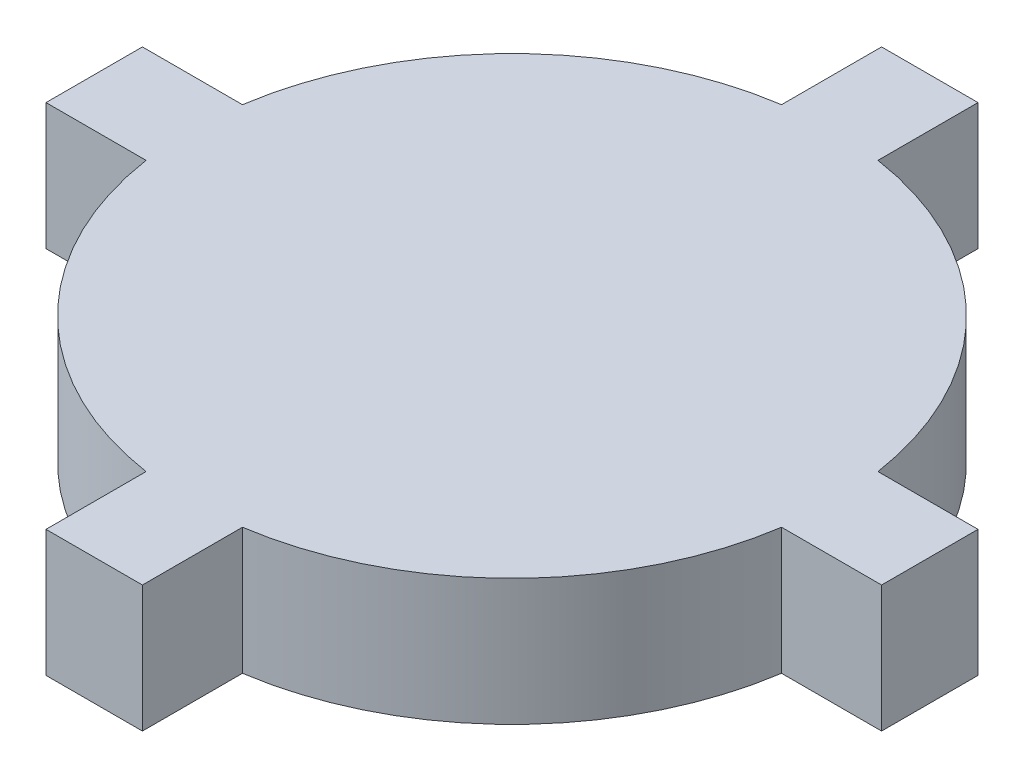
ISO-10303-21;
HEADER;
FILE_DESCRIPTION(('STEP AP214'),'2;1');
FILE_NAME('part.step','',(''),(''),'','','');
FILE_SCHEMA(('AUTOMOTIVE_DESIGN { 1 0 10303 214 1 1 1 1 }'));
ENDSEC;
DATA;
#1=APPLICATION_CONTEXT('core data for automotive mechanical design processes');
#2=APPLICATION_PROTOCOL_DEFINITION('international standard','automotive_design',2000,#1);
#3=PRODUCT_CONTEXT('',#1,'mechanical');
#4=PRODUCT('Part','Part','',(#3));
#5=PRODUCT_RELATED_PRODUCT_CATEGORY('part','',(#4));
#6=PRODUCT_DEFINITION_FORMATION('','',#4);
#7=PRODUCT_DEFINITION_CONTEXT('part definition',#1,'design');
#8=PRODUCT_DEFINITION('design','',#6,#7);
#9=PRODUCT_DEFINITION_SHAPE('','',#8);
#10=(LENGTH_UNIT() NAMED_UNIT(*) SI_UNIT(.MILLI.,.METRE.));
#11=(NAMED_UNIT(*) PLANE_ANGLE_UNIT() SI_UNIT($,.RADIAN.));
#12=(NAMED_UNIT(*) SI_UNIT($,.STERADIAN.) SOLID_ANGLE_UNIT());
#13=UNCERTAINTY_MEASURE_WITH_UNIT(LENGTH_MEASURE(1.E-05),#10,'distance_accuracy_value','');
#14=(GEOMETRIC_REPRESENTATION_CONTEXT(3) GLOBAL_UNCERTAINTY_ASSIGNED_CONTEXT((#13)) GLOBAL_UNIT_ASSIGNED_CONTEXT((#10,
#11,#12)) REPRESENTATION_CONTEXT('',''));
#15=CARTESIAN_POINT('',(0.,0.,0.));
#16=DIRECTION('',(0.,0.,1.));
#17=DIRECTION('',(1.,0.,0.));
#18=AXIS2_PLACEMENT_3D('',#15,#16,#17);
#19=CARTESIAN_POINT('',(16.51,5.,-1.905));
#20=DIRECTION('',(0.,0.,1.));
#21=DIRECTION('',(1.,0.,0.));
#22=AXIS2_PLACEMENT_3D('',#19,#20,#21);
#23=PLANE('',#22);
#24=DIRECTION('',(-1.,0.,0.));
#25=VECTOR('',#24,1.);
#26=CARTESIAN_POINT('',(16.51,0.,-1.905));
#27=LINE('',#26,#25);
#28=CARTESIAN_POINT('',(16.51,0.,-1.905));
#29=VERTEX_POINT('',#28);
#30=CARTESIAN_POINT('',(12.5563121576361,0.,-1.905));
#31=VERTEX_POINT('',#30);
#32=EDGE_CURVE('E183',#29,#31,#27,.T.);
#33=ORIENTED_EDGE('',*,*,#32,.T.);
#34=DIRECTION('',(0.,-1.,0.));
#35=VECTOR('',#34,1.);
#36=CARTESIAN_POINT('',(12.5563121576361,5.,-1.905));
#37=LINE('',#36,#35);
#38=CARTESIAN_POINT('',(12.5563121576361,5.,-1.905));
#39=VERTEX_POINT('',#38);
#40=EDGE_CURVE('E11',#39,#31,#37,.T.);
#41=ORIENTED_EDGE('',*,*,#40,.F.);
#42=DIRECTION('',(-1.,0.,0.));
#43=VECTOR('',#42,1.);
#44=CARTESIAN_POINT('',(16.51,5.,-1.905));
#45=LINE('',#44,#43);
#46=CARTESIAN_POINT('',(16.51,5.,-1.905));
#47=VERTEX_POINT('',#46);
#48=EDGE_CURVE('E213',#47,#39,#45,.T.);
#49=ORIENTED_EDGE('',*,*,#48,.F.);
#50=DIRECTION('',(0.,-1.,0.));
#51=VECTOR('',#50,1.);
#52=CARTESIAN_POINT('',(16.51,5.,-1.905));
#53=LINE('',#52,#51);
#54=EDGE_CURVE('E179',#47,#29,#53,.T.);
#55=ORIENTED_EDGE('',*,*,#54,.T.);
#56=EDGE_LOOP('',(#33,#41,#49,#55));
#57=FACE_BOUND('',#56,.T.);
#58=ADVANCED_FACE('F39',(#57),#23,.F.);
#59=CARTESIAN_POINT('',(0.,5.,0.));
#60=DIRECTION('',(0.,-1.,0.));
#61=DIRECTION('',(0.,0.,-1.));
#62=AXIS2_PLACEMENT_3D('',#59,#60,#61);
#63=CYLINDRICAL_SURFACE('',#62,12.7);
#64=CARTESIAN_POINT('',(0.,0.,0.));
#65=DIRECTION('',(0.,1.,0.));
#66=DIRECTION('',(0.,0.,1.));
#67=AXIS2_PLACEMENT_3D('',#64,#65,#66);
#68=CIRCLE('',#67,12.7);
#69=CARTESIAN_POINT('',(1.90500000000013,0.,-12.5563121576361));
#70=VERTEX_POINT('',#69);
#71=EDGE_CURVE('E186',#31,#70,#68,.T.);
#72=ORIENTED_EDGE('',*,*,#71,.T.);
#73=DIRECTION('',(0.,-1.,0.));
#74=VECTOR('',#73,1.);
#75=CARTESIAN_POINT('',(1.90500000000013,5.,-12.5563121576361));
#76=LINE('',#75,#74);
#77=CARTESIAN_POINT('',(1.90500000000013,5.,-12.5563121576361));
#78=VERTEX_POINT('',#77);
#79=EDGE_CURVE('E47',#78,#70,#76,.T.);
#80=ORIENTED_EDGE('',*,*,#79,.F.);
#81=CARTESIAN_POINT('',(0.,5.,0.));
#82=DIRECTION('',(0.,1.,0.));
#83=DIRECTION('',(0.,0.,1.));
#84=AXIS2_PLACEMENT_3D('',#81,#82,#83);
#85=CIRCLE('',#84,12.7);
#86=EDGE_CURVE('E122',#39,#78,#85,.T.);
#87=ORIENTED_EDGE('',*,*,#86,.F.);
#88=ORIENTED_EDGE('',*,*,#40,.T.);
#89=EDGE_LOOP('',(#72,#80,#87,#88));
#90=FACE_BOUND('',#89,.T.);
#91=ADVANCED_FACE('F311',(#90),#63,.T.);
#92=CARTESIAN_POINT('',(1.90500000000017,5.,-16.51));
#93=DIRECTION('',(-1.,0.,0.));
#94=DIRECTION('',(0.,0.,1.));
#95=AXIS2_PLACEMENT_3D('',#92,#93,#94);
#96=PLANE('',#95);
#97=DIRECTION('',(0.,0.,-1.));
#98=VECTOR('',#97,1.);
#99=CARTESIAN_POINT('',(1.90500000000017,0.,-16.51));
#100=LINE('',#99,#98);
#101=CARTESIAN_POINT('',(1.90500000000017,0.,-16.51));
#102=VERTEX_POINT('',#101);
#103=EDGE_CURVE('E188',#70,#102,#100,.T.);
#104=ORIENTED_EDGE('',*,*,#103,.T.);
#105=DIRECTION('',(0.,-1.,0.));
#106=VECTOR('',#105,1.);
#107=CARTESIAN_POINT('',(1.90500000000017,5.,-16.51));
#108=LINE('',#107,#106);
#109=CARTESIAN_POINT('',(1.90500000000017,5.,-16.51));
#110=VERTEX_POINT('',#109);
#111=EDGE_CURVE('E244',#110,#102,#108,.T.);
#112=ORIENTED_EDGE('',*,*,#111,.F.);
#113=DIRECTION('',(0.,0.,-1.));
#114=VECTOR('',#113,1.);
#115=CARTESIAN_POINT('',(1.90500000000017,5.,-16.51));
#116=LINE('',#115,#114);
#117=EDGE_CURVE('E252',#78,#110,#116,.T.);
#118=ORIENTED_EDGE('',*,*,#117,.F.);
#119=ORIENTED_EDGE('',*,*,#79,.T.);
#120=EDGE_LOOP('',(#104,#112,#118,#119));
#121=FACE_BOUND('',#120,.T.);
#122=ADVANCED_FACE('F250',(#121),#96,.F.);
#123=CARTESIAN_POINT('',(1.90500000000017,5.,-16.51));
#124=DIRECTION('',(0.,0.,1.));
#125=DIRECTION('',(1.,0.,0.));
#126=AXIS2_PLACEMENT_3D('',#123,#124,#125);
#127=PLANE('',#126);
#128=DIRECTION('',(-1.,0.,0.));
#129=VECTOR('',#128,1.);
#130=CARTESIAN_POINT('',(1.90500000000017,0.,-16.51));
#131=LINE('',#130,#129);
#132=CARTESIAN_POINT('',(-1.90499999999983,0.,-16.51));
#133=VERTEX_POINT('',#132);
#134=EDGE_CURVE('E190',#102,#133,#131,.T.);
#135=ORIENTED_EDGE('',*,*,#134,.T.);
#136=DIRECTION('',(0.,-1.,0.));
#137=VECTOR('',#136,1.);
#138=CARTESIAN_POINT('',(-1.90499999999983,5.,-16.51));
#139=LINE('',#138,#137);
#140=CARTESIAN_POINT('',(-1.90499999999983,5.,-16.51));
#141=VERTEX_POINT('',#140);
#142=EDGE_CURVE('E241',#141,#133,#139,.T.);
#143=ORIENTED_EDGE('',*,*,#142,.F.);
#144=DIRECTION('',(-1.,0.,0.));
#145=VECTOR('',#144,1.);
#146=CARTESIAN_POINT('',(1.90500000000017,5.,-16.51));
#147=LINE('',#146,#145);
#148=EDGE_CURVE('E270',#110,#141,#147,.T.);
#149=ORIENTED_EDGE('',*,*,#148,.F.);
#150=ORIENTED_EDGE('',*,*,#111,.T.);
#151=EDGE_LOOP('',(#135,#143,#149,#150));
#152=FACE_BOUND('',#151,.T.);
#153=ADVANCED_FACE('F261',(#152),#127,.F.);
#154=CARTESIAN_POINT('',(-1.90499999999983,5.,-16.51));
#155=DIRECTION('',(1.,0.,0.));
#156=DIRECTION('',(0.,0.,-1.));
#157=AXIS2_PLACEMENT_3D('',#154,#155,#156);
#158=PLANE('',#157);
#159=DIRECTION('',(0.,0.,1.));
#160=VECTOR('',#159,1.);
#161=CARTESIAN_POINT('',(-1.90499999999983,0.,-16.51));
#162=LINE('',#161,#160);
#163=CARTESIAN_POINT('',(-1.90499999999986,0.,-12.5563121576361));
#164=VERTEX_POINT('',#163);
#165=EDGE_CURVE('E192',#133,#164,#162,.T.);
#166=ORIENTED_EDGE('',*,*,#165,.T.);
#167=DIRECTION('',(0.,-1.,0.));
#168=VECTOR('',#167,1.);
#169=CARTESIAN_POINT('',(-1.90499999999986,5.,-12.5563121576361));
#170=LINE('',#169,#168);
#171=CARTESIAN_POINT('',(-1.90499999999986,5.,-12.5563121576361));
#172=VERTEX_POINT('',#171);
#173=EDGE_CURVE('E238',#172,#164,#170,.T.);
#174=ORIENTED_EDGE('',*,*,#173,.F.);
#175=DIRECTION('',(0.,0.,1.));
#176=VECTOR('',#175,1.);
#177=CARTESIAN_POINT('',(-1.90499999999983,5.,-16.51));
#178=LINE('',#177,#176);
#179=EDGE_CURVE('E267',#141,#172,#178,.T.);
#180=ORIENTED_EDGE('',*,*,#179,.F.);
#181=ORIENTED_EDGE('',*,*,#142,.T.);
#182=EDGE_LOOP('',(#166,#174,#180,#181));
#183=FACE_BOUND('',#182,.T.);
#184=ADVANCED_FACE('F265',(#183),#158,.F.);
#185=CARTESIAN_POINT('',(0.,5.,0.));
#186=DIRECTION('',(0.,-1.,0.));
#187=DIRECTION('',(0.,0.,-1.));
#188=AXIS2_PLACEMENT_3D('',#185,#186,#187);
#189=CYLINDRICAL_SURFACE('',#188,12.7);
#190=CARTESIAN_POINT('',(0.,0.,0.));
#191=DIRECTION('',(0.,1.,0.));
#192=DIRECTION('',(0.,0.,1.));
#193=AXIS2_PLACEMENT_3D('',#190,#191,#192);
#194=CIRCLE('',#193,12.7);
#195=CARTESIAN_POINT('',(-12.5563121576361,0.,-1.90500000000009));
#196=VERTEX_POINT('',#195);
#197=EDGE_CURVE('E194',#164,#196,#194,.T.);
#198=ORIENTED_EDGE('',*,*,#197,.T.);
#199=DIRECTION('',(0.,-1.,0.));
#200=VECTOR('',#199,1.);
#201=CARTESIAN_POINT('',(-12.5563121576361,5.,-1.90500000000009));
#202=LINE('',#201,#200);
#203=CARTESIAN_POINT('',(-12.5563121576361,5.,-1.90500000000009));
#204=VERTEX_POINT('',#203);
#205=EDGE_CURVE('E235',#204,#196,#202,.T.);
#206=ORIENTED_EDGE('',*,*,#205,.F.);
#207=CARTESIAN_POINT('',(0.,5.,0.));
#208=DIRECTION('',(0.,1.,0.));
#209=DIRECTION('',(0.,0.,1.));
#210=AXIS2_PLACEMENT_3D('',#207,#208,#209);
#211=CIRCLE('',#210,12.7);
#212=EDGE_CURVE('E269',#172,#204,#211,.T.);
#213=ORIENTED_EDGE('',*,*,#212,.F.);
#214=ORIENTED_EDGE('',*,*,#173,.T.);
#215=EDGE_LOOP('',(#198,#206,#213,#214));
#216=FACE_BOUND('',#215,.T.);
#217=ADVANCED_FACE('F324',(#216),#189,.T.);
#218=CARTESIAN_POINT('',(-16.51,5.,-1.90500000000012));
#219=DIRECTION('',(0.,0.,1.));
#220=DIRECTION('',(1.,0.,0.));
#221=AXIS2_PLACEMENT_3D('',#218,#219,#220);
#222=PLANE('',#221);
#223=DIRECTION('',(-1.,0.,0.));
#224=VECTOR('',#223,1.);
#225=CARTESIAN_POINT('',(-16.51,0.,-1.90500000000012));
#226=LINE('',#225,#224);
#227=CARTESIAN_POINT('',(-16.51,0.,-1.90500000000012));
#228=VERTEX_POINT('',#227);
#229=EDGE_CURVE('E196',#196,#228,#226,.T.);
#230=ORIENTED_EDGE('',*,*,#229,.T.);
#231=DIRECTION('',(0.,-1.,0.));
#232=VECTOR('',#231,1.);
#233=CARTESIAN_POINT('',(-16.51,5.,-1.90500000000012));
#234=LINE('',#233,#232);
#235=CARTESIAN_POINT('',(-16.51,5.,-1.90500000000012));
#236=VERTEX_POINT('',#235);
#237=EDGE_CURVE('E232',#236,#228,#234,.T.);
#238=ORIENTED_EDGE('',*,*,#237,.F.);
#239=DIRECTION('',(-1.,0.,0.));
#240=VECTOR('',#239,1.);
#241=CARTESIAN_POINT('',(-16.51,5.,-1.90500000000012));
#242=LINE('',#241,#240);
#243=EDGE_CURVE('E272',#204,#236,#242,.T.);
#244=ORIENTED_EDGE('',*,*,#243,.F.);
#245=ORIENTED_EDGE('',*,*,#205,.T.);
#246=EDGE_LOOP('',(#230,#238,#244,#245));
#247=FACE_BOUND('',#246,.T.);
#248=ADVANCED_FACE('F327',(#247),#222,.F.);
#249=CARTESIAN_POINT('',(-16.51,5.,-1.90500000000012));
#250=DIRECTION('',(1.,0.,0.));
#251=DIRECTION('',(0.,0.,-1.));
#252=AXIS2_PLACEMENT_3D('',#249,#250,#251);
#253=PLANE('',#252);
#254=DIRECTION('',(0.,0.,1.));
#255=VECTOR('',#254,1.);
#256=CARTESIAN_POINT('',(-16.51,0.,-1.90500000000012));
#257=LINE('',#256,#255);
#258=CARTESIAN_POINT('',(-16.51,0.,1.90499999999988));
#259=VERTEX_POINT('',#258);
#260=EDGE_CURVE('E198',#228,#259,#257,.T.);
#261=ORIENTED_EDGE('',*,*,#260,.T.);
#262=DIRECTION('',(0.,-1.,0.));
#263=VECTOR('',#262,1.);
#264=CARTESIAN_POINT('',(-16.51,5.,1.90499999999988));
#265=LINE('',#264,#263);
#266=CARTESIAN_POINT('',(-16.51,5.,1.90499999999988));
#267=VERTEX_POINT('',#266);
#268=EDGE_CURVE('E229',#267,#259,#265,.T.);
#269=ORIENTED_EDGE('',*,*,#268,.F.);
#270=DIRECTION('',(0.,0.,1.));
#271=VECTOR('',#270,1.);
#272=CARTESIAN_POINT('',(-16.51,5.,-1.90500000000012));
#273=LINE('',#272,#271);
#274=EDGE_CURVE('E278',#236,#267,#273,.T.);
#275=ORIENTED_EDGE('',*,*,#274,.F.);
#276=ORIENTED_EDGE('',*,*,#237,.T.);
#277=EDGE_LOOP('',(#261,#269,#275,#276));
#278=FACE_BOUND('',#277,.T.);
#279=ADVANCED_FACE('F331',(#278),#253,.F.);
#280=CARTESIAN_POINT('',(-16.51,5.,1.90499999999988));
#281=DIRECTION('',(0.,0.,-1.));
#282=DIRECTION('',(-1.,0.,0.));
#283=AXIS2_PLACEMENT_3D('',#280,#281,#282);
#284=PLANE('',#283);
#285=DIRECTION('',(1.,0.,0.));
#286=VECTOR('',#285,1.);
#287=CARTESIAN_POINT('',(-16.51,0.,1.90499999999988));
#288=LINE('',#287,#286);
#289=CARTESIAN_POINT('',(-12.5563121576361,0.,1.90499999999991));
#290=VERTEX_POINT('',#289);
#291=EDGE_CURVE('E200',#259,#290,#288,.T.);
#292=ORIENTED_EDGE('',*,*,#291,.T.);
#293=DIRECTION('',(0.,-1.,0.));
#294=VECTOR('',#293,1.);
#295=CARTESIAN_POINT('',(-12.5563121576361,5.,1.90499999999991));
#296=LINE('',#295,#294);
#297=CARTESIAN_POINT('',(-12.5563121576361,5.,1.90499999999991));
#298=VERTEX_POINT('',#297);
#299=EDGE_CURVE('E226',#298,#290,#296,.T.);
#300=ORIENTED_EDGE('',*,*,#299,.F.);
#301=DIRECTION('',(1.,0.,0.));
#302=VECTOR('',#301,1.);
#303=CARTESIAN_POINT('',(-16.51,5.,1.90499999999988));
#304=LINE('',#303,#302);
#305=EDGE_CURVE('E280',#267,#298,#304,.T.);
#306=ORIENTED_EDGE('',*,*,#305,.F.);
#307=ORIENTED_EDGE('',*,*,#268,.T.);
#308=EDGE_LOOP('',(#292,#300,#306,#307));
#309=FACE_BOUND('',#308,.T.);
#310=ADVANCED_FACE('F335',(#309),#284,.F.);
#311=CARTESIAN_POINT('',(0.,5.,0.));
#312=DIRECTION('',(0.,-1.,0.));
#313=DIRECTION('',(0.,0.,-1.));
#314=AXIS2_PLACEMENT_3D('',#311,#312,#313);
#315=CYLINDRICAL_SURFACE('',#314,12.7);
#316=CARTESIAN_POINT('',(0.,0.,0.));
#317=DIRECTION('',(0.,1.,0.));
#318=DIRECTION('',(0.,0.,1.));
#319=AXIS2_PLACEMENT_3D('',#316,#317,#318);
#320=CIRCLE('',#319,12.7);
#321=CARTESIAN_POINT('',(-1.90500000000004,0.,12.5563121576361));
#322=VERTEX_POINT('',#321);
#323=EDGE_CURVE('E202',#290,#322,#320,.T.);
#324=ORIENTED_EDGE('',*,*,#323,.T.);
#325=DIRECTION('',(0.,-1.,0.));
#326=VECTOR('',#325,1.);
#327=CARTESIAN_POINT('',(-1.90500000000004,5.,12.5563121576361));
#328=LINE('',#327,#326);
#329=CARTESIAN_POINT('',(-1.90500000000004,5.,12.5563121576361));
#330=VERTEX_POINT('',#329);
#331=EDGE_CURVE('E223',#330,#322,#328,.T.);
#332=ORIENTED_EDGE('',*,*,#331,.F.);
#333=CARTESIAN_POINT('',(0.,5.,0.));
#334=DIRECTION('',(0.,1.,0.));
#335=DIRECTION('',(0.,0.,1.));
#336=AXIS2_PLACEMENT_3D('',#333,#334,#335);
#337=CIRCLE('',#336,12.7);
#338=EDGE_CURVE('E282',#298,#330,#337,.T.);
#339=ORIENTED_EDGE('',*,*,#338,.F.);
#340=ORIENTED_EDGE('',*,*,#299,.T.);
#341=EDGE_LOOP('',(#324,#332,#339,#340));
#342=FACE_BOUND('',#341,.T.);
#343=ADVANCED_FACE('F339',(#342),#315,.T.);
#344=CARTESIAN_POINT('',(-1.90500000000006,5.,16.51));
#345=DIRECTION('',(1.,0.,0.));
#346=DIRECTION('',(0.,0.,-1.));
#347=AXIS2_PLACEMENT_3D('',#344,#345,#346);
#348=PLANE('',#347);
#349=DIRECTION('',(0.,0.,1.));
#350=VECTOR('',#349,1.);
#351=CARTESIAN_POINT('',(-1.90500000000006,0.,16.51));
#352=LINE('',#351,#350);
#353=CARTESIAN_POINT('',(-1.90500000000006,0.,16.51));
#354=VERTEX_POINT('',#353);
#355=EDGE_CURVE('E204',#322,#354,#352,.T.);
#356=ORIENTED_EDGE('',*,*,#355,.T.);
#357=DIRECTION('',(0.,-1.,0.));
#358=VECTOR('',#357,1.);
#359=CARTESIAN_POINT('',(-1.90500000000006,5.,16.51));
#360=LINE('',#359,#358);
#361=CARTESIAN_POINT('',(-1.90500000000006,5.,16.51));
#362=VERTEX_POINT('',#361);
#363=EDGE_CURVE('E220',#362,#354,#360,.T.);
#364=ORIENTED_EDGE('',*,*,#363,.F.);
#365=DIRECTION('',(0.,0.,1.));
#366=VECTOR('',#365,1.);
#367=CARTESIAN_POINT('',(-1.90500000000006,5.,16.51));
#368=LINE('',#367,#366);
#369=EDGE_CURVE('E284',#330,#362,#368,.T.);
#370=ORIENTED_EDGE('',*,*,#369,.F.);
#371=ORIENTED_EDGE('',*,*,#331,.T.);
#372=EDGE_LOOP('',(#356,#364,#370,#371));
#373=FACE_BOUND('',#372,.T.);
#374=ADVANCED_FACE('F343',(#373),#348,.F.);
#375=CARTESIAN_POINT('',(-1.90500000000006,5.,16.51));
#376=DIRECTION('',(0.,0.,-1.));
#377=DIRECTION('',(-1.,0.,0.));
#378=AXIS2_PLACEMENT_3D('',#375,#376,#377);
#379=PLANE('',#378);
#380=DIRECTION('',(1.,0.,0.));
#381=VECTOR('',#380,1.);
#382=CARTESIAN_POINT('',(-1.90500000000006,0.,16.51));
#383=LINE('',#382,#381);
#384=CARTESIAN_POINT('',(1.90499999999994,0.,16.51));
#385=VERTEX_POINT('',#384);
#386=EDGE_CURVE('E206',#354,#385,#383,.T.);
#387=ORIENTED_EDGE('',*,*,#386,.T.);
#388=DIRECTION('',(0.,-1.,0.));
#389=VECTOR('',#388,1.);
#390=CARTESIAN_POINT('',(1.90499999999994,5.,16.51));
#391=LINE('',#390,#389);
#392=CARTESIAN_POINT('',(1.90499999999994,5.,16.51));
#393=VERTEX_POINT('',#392);
#394=EDGE_CURVE('E217',#393,#385,#391,.T.);
#395=ORIENTED_EDGE('',*,*,#394,.F.);
#396=DIRECTION('',(1.,0.,0.));
#397=VECTOR('',#396,1.);
#398=CARTESIAN_POINT('',(-1.90500000000006,5.,16.51));
#399=LINE('',#398,#397);
#400=EDGE_CURVE('E286',#362,#393,#399,.T.);
#401=ORIENTED_EDGE('',*,*,#400,.F.);
#402=ORIENTED_EDGE('',*,*,#363,.T.);
#403=EDGE_LOOP('',(#387,#395,#401,#402));
#404=FACE_BOUND('',#403,.T.);
#405=ADVANCED_FACE('F292',(#404),#379,.F.);
#406=CARTESIAN_POINT('',(1.90499999999994,5.,16.51));
#407=DIRECTION('',(-1.,0.,0.));
#408=DIRECTION('',(0.,0.,1.));
#409=AXIS2_PLACEMENT_3D('',#406,#407,#408);
#410=PLANE('',#409);
#411=DIRECTION('',(0.,0.,-1.));
#412=VECTOR('',#411,1.);
#413=CARTESIAN_POINT('',(1.90499999999994,0.,16.51));
#414=LINE('',#413,#412);
#415=CARTESIAN_POINT('',(1.90499999999996,0.,12.5563121576361));
#416=VERTEX_POINT('',#415);
#417=EDGE_CURVE('E208',#385,#416,#414,.T.);
#418=ORIENTED_EDGE('',*,*,#417,.T.);
#419=DIRECTION('',(0.,-1.,0.));
#420=VECTOR('',#419,1.);
#421=CARTESIAN_POINT('',(1.90499999999996,5.,12.5563121576361));
#422=LINE('',#421,#420);
#423=CARTESIAN_POINT('',(1.90499999999996,5.,12.5563121576361));
#424=VERTEX_POINT('',#423);
#425=EDGE_CURVE('E174',#424,#416,#422,.T.);
#426=ORIENTED_EDGE('',*,*,#425,.F.);
#427=DIRECTION('',(0.,0.,-1.));
#428=VECTOR('',#427,1.);
#429=CARTESIAN_POINT('',(1.90499999999994,5.,16.51));
#430=LINE('',#429,#428);
#431=EDGE_CURVE('E165',#393,#424,#430,.T.);
#432=ORIENTED_EDGE('',*,*,#431,.F.);
#433=ORIENTED_EDGE('',*,*,#394,.T.);
#434=EDGE_LOOP('',(#418,#426,#432,#433));
#435=FACE_BOUND('',#434,.T.);
#436=ADVANCED_FACE('F296',(#435),#410,.F.);
#437=CARTESIAN_POINT('',(0.,5.,0.));
#438=DIRECTION('',(0.,-1.,0.));
#439=DIRECTION('',(0.,0.,-1.));
#440=AXIS2_PLACEMENT_3D('',#437,#438,#439);
#441=CYLINDRICAL_SURFACE('',#440,12.7);
#442=CARTESIAN_POINT('',(0.,0.,0.));
#443=DIRECTION('',(0.,1.,0.));
#444=DIRECTION('',(0.,0.,1.));
#445=AXIS2_PLACEMENT_3D('',#442,#443,#444);
#446=CIRCLE('',#445,12.7);
#447=CARTESIAN_POINT('',(12.5563121576361,0.,1.905));
#448=VERTEX_POINT('',#447);
#449=EDGE_CURVE('E173',#416,#448,#446,.T.);
#450=ORIENTED_EDGE('',*,*,#449,.T.);
#451=DIRECTION('',(0.,-1.,0.));
#452=VECTOR('',#451,1.);
#453=CARTESIAN_POINT('',(12.5563121576361,5.,1.905));
#454=LINE('',#453,#452);
#455=CARTESIAN_POINT('',(12.5563121576361,5.,1.905));
#456=VERTEX_POINT('',#455);
#457=EDGE_CURVE('E170',#456,#448,#454,.T.);
#458=ORIENTED_EDGE('',*,*,#457,.F.);
#459=CARTESIAN_POINT('',(0.,5.,0.));
#460=DIRECTION('',(0.,1.,0.));
#461=DIRECTION('',(0.,0.,1.));
#462=AXIS2_PLACEMENT_3D('',#459,#460,#461);
#463=CIRCLE('',#462,12.7);
#464=EDGE_CURVE('E159',#424,#456,#463,.T.);
#465=ORIENTED_EDGE('',*,*,#464,.F.);
#466=ORIENTED_EDGE('',*,*,#425,.T.);
#467=EDGE_LOOP('',(#450,#458,#465,#466));
#468=FACE_BOUND('',#467,.T.);
#469=ADVANCED_FACE('F171',(#468),#441,.T.);
#470=CARTESIAN_POINT('',(16.51,5.,1.905));
#471=DIRECTION('',(0.,0.,-1.));
#472=DIRECTION('',(-1.,0.,0.));
#473=AXIS2_PLACEMENT_3D('',#470,#471,#472);
#474=PLANE('',#473);
#475=DIRECTION('',(1.,0.,0.));
#476=VECTOR('',#475,1.);
#477=CARTESIAN_POINT('',(16.51,0.,1.905));
#478=LINE('',#477,#476);
#479=CARTESIAN_POINT('',(16.51,0.,1.905));
#480=VERTEX_POINT('',#479);
#481=EDGE_CURVE('E108',#448,#480,#478,.T.);
#482=ORIENTED_EDGE('',*,*,#481,.T.);
#483=DIRECTION('',(0.,-1.,0.));
#484=VECTOR('',#483,1.);
#485=CARTESIAN_POINT('',(16.51,5.,1.905));
#486=LINE('',#485,#484);
#487=CARTESIAN_POINT('',(16.51,5.,1.905));
#488=VERTEX_POINT('',#487);
#489=EDGE_CURVE('E175',#488,#480,#486,.T.);
#490=ORIENTED_EDGE('',*,*,#489,.F.);
#491=DIRECTION('',(1.,0.,0.));
#492=VECTOR('',#491,1.);
#493=CARTESIAN_POINT('',(16.51,5.,1.905));
#494=LINE('',#493,#492);
#495=EDGE_CURVE('E163',#456,#488,#494,.T.);
#496=ORIENTED_EDGE('',*,*,#495,.F.);
#497=ORIENTED_EDGE('',*,*,#457,.T.);
#498=EDGE_LOOP('',(#482,#490,#496,#497));
#499=FACE_BOUND('',#498,.T.);
#500=ADVANCED_FACE('F177',(#499),#474,.F.);
#501=CARTESIAN_POINT('',(16.51,5.,1.905));
#502=DIRECTION('',(-1.,0.,0.));
#503=DIRECTION('',(0.,0.,1.));
#504=AXIS2_PLACEMENT_3D('',#501,#502,#503);
#505=PLANE('',#504);
#506=DIRECTION('',(0.,0.,-1.));
#507=VECTOR('',#506,1.);
#508=CARTESIAN_POINT('',(16.51,0.,1.905));
#509=LINE('',#508,#507);
#510=EDGE_CURVE('E114',#480,#29,#509,.T.);
#511=ORIENTED_EDGE('',*,*,#510,.T.);
#512=ORIENTED_EDGE('',*,*,#54,.F.);
#513=DIRECTION('',(0.,0.,-1.));
#514=VECTOR('',#513,1.);
#515=CARTESIAN_POINT('',(16.51,5.,1.905));
#516=LINE('',#515,#514);
#517=EDGE_CURVE('E55',#488,#47,#516,.T.);
#518=ORIENTED_EDGE('',*,*,#517,.F.);
#519=ORIENTED_EDGE('',*,*,#489,.T.);
#520=EDGE_LOOP('',(#511,#512,#518,#519));
#521=FACE_BOUND('',#520,.T.);
#522=ADVANCED_FACE('F300',(#521),#505,.F.);
#523=CARTESIAN_POINT('',(0.,5.,0.));
#524=DIRECTION('',(0.,1.,0.));
#525=DIRECTION('',(0.,0.,1.));
#526=AXIS2_PLACEMENT_3D('',#523,#524,#525);
#527=PLANE('',#526);
#528=ORIENTED_EDGE('',*,*,#48,.T.);
#529=ORIENTED_EDGE('',*,*,#86,.T.);
#530=ORIENTED_EDGE('',*,*,#117,.T.);
#531=ORIENTED_EDGE('',*,*,#148,.T.);
#532=ORIENTED_EDGE('',*,*,#179,.T.);
#533=ORIENTED_EDGE('',*,*,#212,.T.);
#534=ORIENTED_EDGE('',*,*,#243,.T.);
#535=ORIENTED_EDGE('',*,*,#274,.T.);
#536=ORIENTED_EDGE('',*,*,#305,.T.);
#537=ORIENTED_EDGE('',*,*,#338,.T.);
#538=ORIENTED_EDGE('',*,*,#369,.T.);
#539=ORIENTED_EDGE('',*,*,#400,.T.);
#540=ORIENTED_EDGE('',*,*,#431,.T.);
#541=ORIENTED_EDGE('',*,*,#464,.T.);
#542=ORIENTED_EDGE('',*,*,#495,.T.);
#543=ORIENTED_EDGE('',*,*,#517,.T.);
#544=EDGE_LOOP('',(#528,#529,#530,#531,#532,#533,#534,#535,#536,#537,#538,#539,#540,#541,#542,#543));
#545=FACE_BOUND('',#544,.T.);
#546=ADVANCED_FACE('F161',(#545),#527,.T.);
#547=CARTESIAN_POINT('',(0.,0.,0.));
#548=DIRECTION('',(0.,1.,0.));
#549=DIRECTION('',(0.,0.,1.));
#550=AXIS2_PLACEMENT_3D('',#547,#548,#549);
#551=PLANE('',#550);
#552=ORIENTED_EDGE('',*,*,#32,.F.);
#553=ORIENTED_EDGE('',*,*,#510,.F.);
#554=ORIENTED_EDGE('',*,*,#481,.F.);
#555=ORIENTED_EDGE('',*,*,#449,.F.);
#556=ORIENTED_EDGE('',*,*,#417,.F.);
#557=ORIENTED_EDGE('',*,*,#386,.F.);
#558=ORIENTED_EDGE('',*,*,#355,.F.);
#559=ORIENTED_EDGE('',*,*,#323,.F.);
#560=ORIENTED_EDGE('',*,*,#291,.F.);
#561=ORIENTED_EDGE('',*,*,#260,.F.);
#562=ORIENTED_EDGE('',*,*,#229,.F.);
#563=ORIENTED_EDGE('',*,*,#197,.F.);
#564=ORIENTED_EDGE('',*,*,#165,.F.);
#565=ORIENTED_EDGE('',*,*,#134,.F.);
#566=ORIENTED_EDGE('',*,*,#103,.F.);
#567=ORIENTED_EDGE('',*,*,#71,.F.);
#568=EDGE_LOOP('',(#552,#553,#554,#555,#556,#557,#558,#559,#560,#561,#562,#563,#564,#565,#566,#567));
#569=FACE_BOUND('',#568,.T.);
#570=ADVANCED_FACE('F256',(#569),#551,.F.);
#571=CLOSED_SHELL('',(#58,#91,#122,#153,#184,#217,#248,#279,#310,#343,#374,#405,#436,#469,#500,
#522,#546,#570));
#572=MANIFOLD_SOLID_BREP('B2',#571);
#573=ADVANCED_BREP_SHAPE_REPRESENTATION('',(#18,#572),#14);
#574=SHAPE_DEFINITION_REPRESENTATION(#9,#573);
ENDSEC;
END-ISO-10303-21;
